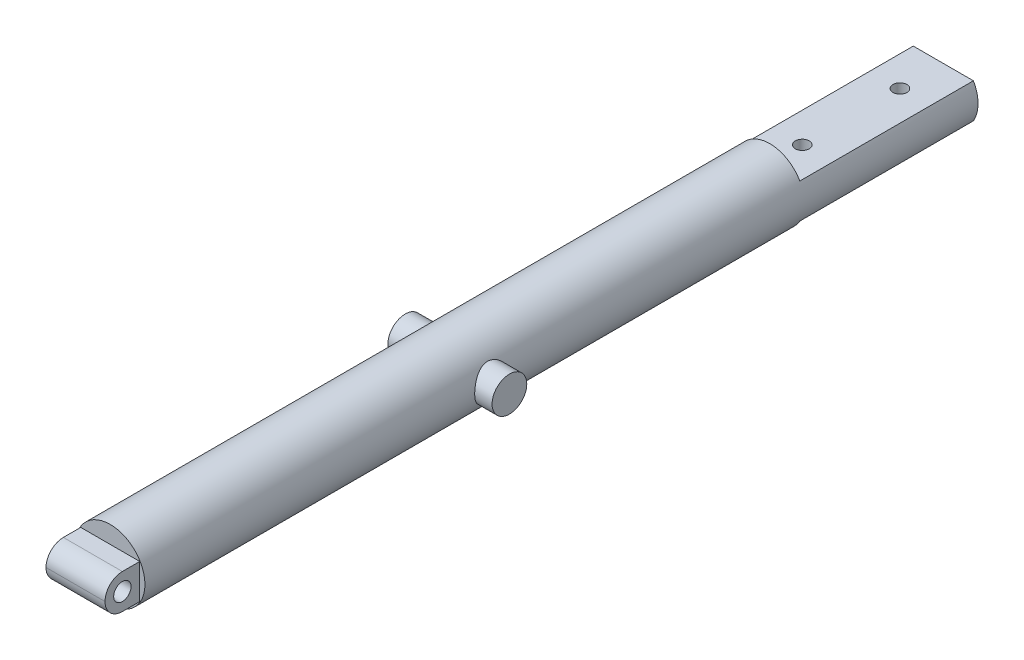
ISO-10303-21;
HEADER;
FILE_DESCRIPTION(('STEP AP214'),'2;1');
FILE_NAME('part.step','',(''),(''),'','','');
FILE_SCHEMA(('AUTOMOTIVE_DESIGN { 1 0 10303 214 1 1 1 1 }'));
ENDSEC;
DATA;
#1=APPLICATION_CONTEXT('core data for automotive mechanical design processes');
#2=APPLICATION_PROTOCOL_DEFINITION('international standard','automotive_design',2000,#1);
#3=PRODUCT_CONTEXT('',#1,'mechanical');
#4=PRODUCT('Part','Part','',(#3));
#5=PRODUCT_RELATED_PRODUCT_CATEGORY('part','',(#4));
#6=PRODUCT_DEFINITION_FORMATION('','',#4);
#7=PRODUCT_DEFINITION_CONTEXT('part definition',#1,'design');
#8=PRODUCT_DEFINITION('design','',#6,#7);
#9=PRODUCT_DEFINITION_SHAPE('','',#8);
#10=(LENGTH_UNIT() NAMED_UNIT(*) SI_UNIT(.MILLI.,.METRE.));
#11=(NAMED_UNIT(*) PLANE_ANGLE_UNIT() SI_UNIT($,.RADIAN.));
#12=(NAMED_UNIT(*) SI_UNIT($,.STERADIAN.) SOLID_ANGLE_UNIT());
#13=UNCERTAINTY_MEASURE_WITH_UNIT(LENGTH_MEASURE(1.E-05),#10,'distance_accuracy_value','');
#14=(GEOMETRIC_REPRESENTATION_CONTEXT(3) GLOBAL_UNCERTAINTY_ASSIGNED_CONTEXT((#13)) GLOBAL_UNIT_ASSIGNED_CONTEXT((#10,
#11,#12)) REPRESENTATION_CONTEXT('',''));
#15=CARTESIAN_POINT('',(0.,0.,0.));
#16=DIRECTION('',(0.,0.,1.));
#17=DIRECTION('',(1.,0.,0.));
#18=AXIS2_PLACEMENT_3D('',#15,#16,#17);
#19=CARTESIAN_POINT('',(0.,0.,152.4));
#20=DIRECTION('',(0.,0.,1.));
#21=DIRECTION('',(1.,0.,0.));
#22=AXIS2_PLACEMENT_3D('',#19,#20,#21);
#23=PLANE('',#22);
#24=CARTESIAN_POINT('',(0.,0.,152.4));
#25=DIRECTION('',(0.,0.,1.));
#26=DIRECTION('',(1.,0.,0.));
#27=AXIS2_PLACEMENT_3D('',#24,#25,#26);
#28=CIRCLE('',#27,12.7);
#29=CARTESIAN_POINT('',(12.7,0.,152.4));
#30=VERTEX_POINT('',#29);
#31=EDGE_CURVE('E186',#30,#30,#28,.T.);
#32=ORIENTED_EDGE('',*,*,#31,.T.);
#33=EDGE_LOOP('',(#32));
#34=FACE_BOUND('',#33,.T.);
#35=DIRECTION('',(0.,-1.,0.));
#36=VECTOR('',#35,1.);
#37=CARTESIAN_POINT('',(-10.795,6.35000000000002,152.4));
#38=LINE('',#37,#36);
#39=CARTESIAN_POINT('',(-10.795,6.35000000000002,152.4));
#40=VERTEX_POINT('',#39);
#41=CARTESIAN_POINT('',(-10.795,-6.35000000000001,152.4));
#42=VERTEX_POINT('',#41);
#43=EDGE_CURVE('E139',#40,#42,#38,.T.);
#44=ORIENTED_EDGE('',*,*,#43,.F.);
#45=DIRECTION('',(1.,0.,0.));
#46=VECTOR('',#45,1.);
#47=CARTESIAN_POINT('',(-10.795,6.35000000000002,152.4));
#48=LINE('',#47,#46);
#49=CARTESIAN_POINT('',(10.795,6.35000000000002,152.4));
#50=VERTEX_POINT('',#49);
#51=EDGE_CURVE('E281',#40,#50,#48,.T.);
#52=ORIENTED_EDGE('',*,*,#51,.T.);
#53=DIRECTION('',(0.,-1.,0.));
#54=VECTOR('',#53,1.);
#55=CARTESIAN_POINT('',(10.795,6.35000000000002,152.4));
#56=LINE('',#55,#54);
#57=CARTESIAN_POINT('',(10.795,-6.35000000000001,152.4));
#58=VERTEX_POINT('',#57);
#59=EDGE_CURVE('E142',#50,#58,#56,.T.);
#60=ORIENTED_EDGE('',*,*,#59,.T.);
#61=DIRECTION('',(1.,0.,0.));
#62=VECTOR('',#61,1.);
#63=CARTESIAN_POINT('',(-10.795,-6.35000000000001,152.4));
#64=LINE('',#63,#62);
#65=EDGE_CURVE('E128',#42,#58,#64,.T.);
#66=ORIENTED_EDGE('',*,*,#65,.F.);
#67=EDGE_LOOP('',(#44,#52,#60,#66));
#68=FACE_BOUND('',#67,.T.);
#69=ADVANCED_FACE('F56',(#34,#68),#23,.T.);
#70=CARTESIAN_POINT('',(0.,0.,152.4));
#71=DIRECTION('',(0.,0.,-1.));
#72=DIRECTION('',(-1.,0.,0.));
#73=AXIS2_PLACEMENT_3D('',#70,#71,#72);
#74=CYLINDRICAL_SURFACE('',#73,12.7);
#75=CARTESIAN_POINT('',(-12.7,0.,31.7500000000001));
#76=CARTESIAN_POINT('',(-12.6999994891774,0.166990879194913,31.7499994421759));
#77=CARTESIAN_POINT('',(-12.6966986728259,0.333993450198631,31.7434051711993));
#78=CARTESIAN_POINT('',(-12.6835786203218,0.666768526640046,31.7171033286682));
#79=CARTESIAN_POINT('',(-12.6737565484519,0.832540465223132,31.6973900524077));
#80=CARTESIAN_POINT('',(-12.6478292478082,1.16177467728404,31.6450462013111));
#81=CARTESIAN_POINT('',(-12.6317150589571,1.32523331106835,31.6123972048197));
#82=CARTESIAN_POINT('',(-12.5936085062318,1.6484934824779,31.5345436700231));
#83=CARTESIAN_POINT('',(-12.5716137398496,1.80829349634149,31.4893339997624));
#84=CARTESIAN_POINT('',(-12.5223959142721,2.12244180878879,31.3870611803295));
#85=CARTESIAN_POINT('',(-12.4951959650805,2.27681076158406,31.3300503379439));
#86=CARTESIAN_POINT('',(-12.436150269919,2.57993454237571,31.2046002780589));
#87=CARTESIAN_POINT('',(-12.4043027843762,2.728687241851,31.1361567799234));
#88=CARTESIAN_POINT('',(-12.302881193969,3.16512812193646,30.9145916735138));
#89=CARTESIAN_POINT('',(-12.2273713354024,3.44334503957525,30.7451216410393));
#90=CARTESIAN_POINT('',(-12.0622186773861,3.98471796121714,30.3560574939862));
#91=CARTESIAN_POINT('',(-11.9719972312188,4.24594454614361,30.1340512417935));
#92=CARTESIAN_POINT('',(-11.7893960148839,4.72936553155197,29.6511481911965));
#93=CARTESIAN_POINT('',(-11.6970146601478,4.95153018780441,29.3902220337444));
#94=CARTESIAN_POINT('',(-11.5603243398217,5.2595539877823,28.9628248667094));
#95=CARTESIAN_POINT('',(-11.5134721485475,5.3610627049131,28.8082038937615));
#96=CARTESIAN_POINT('',(-11.4233099497228,5.55058368760463,28.4899476154752));
#97=CARTESIAN_POINT('',(-11.3799984680683,5.63860158329208,28.3263161094703));
#98=CARTESIAN_POINT('',(-11.2984098057888,5.800358082891,27.9909478644053));
#99=CARTESIAN_POINT('',(-11.2601322945723,5.87409762464252,27.8192116586055));
#100=CARTESIAN_POINT('',(-11.1900882100936,6.0064578883652,27.4688169432002));
#101=CARTESIAN_POINT('',(-11.1583177917589,6.0650875441624,27.2901625962079));
#102=CARTESIAN_POINT('',(-11.104259497995,6.16347180761616,26.9380237910297));
#103=CARTESIAN_POINT('',(-11.08151961136,6.20414249112448,26.7648649825109));
#104=CARTESIAN_POINT('',(-11.0438804844397,6.27089941680447,26.4149100900956));
#105=CARTESIAN_POINT('',(-11.0289809087597,6.29698628284913,26.2381141621247));
#106=CARTESIAN_POINT('',(-11.0076763086803,6.33415533919377,25.8825907052358));
#107=CARTESIAN_POINT('',(-11.0012640993806,6.34525022098376,25.7038649394044));
#108=CARTESIAN_POINT('',(-10.9972004886715,6.35229110757549,25.3460234576936));
#109=CARTESIAN_POINT('',(-10.9995482514047,6.34823855771195,25.1669077806486));
#110=CARTESIAN_POINT('',(-11.012090292946,6.32645177136463,24.831417698125));
#111=CARTESIAN_POINT('',(-11.0213095833287,6.31041699475489,24.6748926401298));
#112=CARTESIAN_POINT('',(-11.046128374712,6.2668713449148,24.3639094653422));
#113=CARTESIAN_POINT('',(-11.0617299789813,6.23935668847137,24.2094520472785));
#114=CARTESIAN_POINT('',(-11.0988027904553,6.17316873448519,23.903688703298));
#115=CARTESIAN_POINT('',(-11.120273227066,6.13449690187387,23.7523823664406));
#116=CARTESIAN_POINT('',(-11.1684190383084,6.04639785576762,23.4537613579967));
#117=CARTESIAN_POINT('',(-11.1950964580098,5.99696641549928,23.3064482807581));
#118=CARTESIAN_POINT('',(-11.2831376118079,5.83067999912415,22.8650712730653));
#119=CARTESIAN_POINT('',(-11.351625656313,5.69733157989736,22.5784494378062));
#120=CARTESIAN_POINT('',(-11.500071400071,5.39139880582654,22.0304231498828));
#121=CARTESIAN_POINT('',(-11.5800342452273,5.21879682720651,21.7690300995701));
#122=CARTESIAN_POINT('',(-11.7546812882033,4.81373716307426,21.2438125690413));
#123=CARTESIAN_POINT('',(-11.8499465086129,4.57646495884525,20.9838823296492));
#124=CARTESIAN_POINT('',(-12.0362854764244,4.06112275052911,20.5057965991382));
#125=CARTESIAN_POINT('',(-12.1273572049436,3.78303336001456,20.2876610728589));
#126=CARTESIAN_POINT('',(-12.255938857257,3.33286643739698,19.9917786254829));
#127=CARTESIAN_POINT('',(-12.2983050254296,3.17335722609793,19.8966401532776));
#128=CARTESIAN_POINT('',(-12.3782218301755,2.8456977162644,19.7202932887564));
#129=CARTESIAN_POINT('',(-12.4157746297482,2.67755134695863,19.6390786338708));
#130=CARTESIAN_POINT('',(-12.4849579292559,2.33378760343931,19.4914534288931));
#131=CARTESIAN_POINT('',(-12.5165907293456,2.15817316355139,19.4250371271345));
#132=CARTESIAN_POINT('',(-12.5729876360055,1.80074808519267,19.3077783400176));
#133=CARTESIAN_POINT('',(-12.5977525327026,1.61893816219402,19.2569340630848));
#134=CARTESIAN_POINT('',(-12.6378915597613,1.26593635485429,19.1750530402546));
#135=CARTESIAN_POINT('',(-12.6538736459652,1.09511243698786,19.1427244136913));
#136=CARTESIAN_POINT('',(-12.6789562420375,0.750891318848444,19.0921544116369));
#137=CARTESIAN_POINT('',(-12.6880571262137,0.577494259066557,19.0739122699003));
#138=CARTESIAN_POINT('',(-12.6991158370576,0.229629611373428,19.0517612761007));
#139=CARTESIAN_POINT('',(-12.7010765197081,0.0551624794535747,19.0478466932072));
#140=CARTESIAN_POINT('',(-12.6978059034872,-0.293430507417557,19.0543886079495));
#141=CARTESIAN_POINT('',(-12.6925749229034,-0.467556377130821,19.0648444695801));
#142=CARTESIAN_POINT('',(-12.6757555094506,-0.800509536744057,19.0986136315206));
#143=CARTESIAN_POINT('',(-12.6646934781011,-0.959472887164135,19.1208630740019));
#144=CARTESIAN_POINT('',(-12.6368459564446,-1.27482840052129,19.1772211624817));
#145=CARTESIAN_POINT('',(-12.6200585231077,-1.43121967165999,19.2113338345825));
#146=CARTESIAN_POINT('',(-12.581159973299,-1.74030776864039,19.291047952959));
#147=CARTESIAN_POINT('',(-12.5590505630802,-1.89300576133386,19.3366457172723));
#148=CARTESIAN_POINT('',(-12.5099971792976,-2.19390570072535,19.4389143910585));
#149=CARTESIAN_POINT('',(-12.4830513245292,-2.34210587161404,19.4955896100324));
#150=CARTESIAN_POINT('',(-12.4240951779885,-2.63725856238891,19.621262293972));
#151=CARTESIAN_POINT('',(-12.3919635638501,-2.78405822350623,19.6905620050969));
#152=CARTESIAN_POINT('',(-12.32392525103,-3.07126756713197,19.8397813940777));
#153=CARTESIAN_POINT('',(-12.2880172735192,-3.21167506178123,19.9197046719357));
#154=CARTESIAN_POINT('',(-12.1757741292216,-3.62227376445689,20.1745491136815));
#155=CARTESIAN_POINT('',(-12.0948877082824,-3.8819954012841,20.3646110787881));
#156=CARTESIAN_POINT('',(-11.9194499483036,-4.39279994151147,20.8011398441674));
#157=CARTESIAN_POINT('',(-11.8243367236915,-4.64052990372702,21.0513128051332));
#158=CARTESIAN_POINT('',(-11.6839772811164,-4.97892395439651,21.4549100898515));
#159=CARTESIAN_POINT('',(-11.6375432562751,-5.08625380253177,21.5942761051402));
#160=CARTESIAN_POINT('',(-11.5466734049483,-5.2892990887901,21.8819337426791));
#161=CARTESIAN_POINT('',(-11.5022378780468,-5.38501278922796,22.030226695378));
#162=CARTESIAN_POINT('',(-11.4145838039713,-5.56849389071526,22.3424281006111));
#163=CARTESIAN_POINT('',(-11.3715304916549,-5.65564549590478,22.5067454440509));
#164=CARTESIAN_POINT('',(-11.290579644901,-5.81556909376682,22.8433705339));
#165=CARTESIAN_POINT('',(-11.2526796279935,-5.88834801781485,23.0156743789891));
#166=CARTESIAN_POINT('',(-11.1834979926119,-6.01870593214496,23.3670791641594));
#167=CARTESIAN_POINT('',(-11.1522110654534,-6.07629712370975,23.5461745150594));
#168=CARTESIAN_POINT('',(-11.0975495796607,-6.1755660505623,23.9098983380203));
#169=CARTESIAN_POINT('',(-11.0741737959829,-6.21724624980147,24.0945259485843));
#170=CARTESIAN_POINT('',(-11.038221566145,-6.28083303239845,24.4497382585254));
#171=CARTESIAN_POINT('',(-11.0248238589961,-6.30425367574493,24.619969699185));
#172=CARTESIAN_POINT('',(-11.0059068618669,-6.33722186745438,24.9622059736914));
#173=CARTESIAN_POINT('',(-11.0003870360907,-6.34677035930015,25.1342106861318));
#174=CARTESIAN_POINT('',(-10.9974561088362,-6.3518475564986,25.4784312834341));
#175=CARTESIAN_POINT('',(-11.0000420081603,-6.34738144738997,25.6506470666263));
#176=CARTESIAN_POINT('',(-11.0132073594892,-6.32451076696088,25.9938336660464));
#177=CARTESIAN_POINT('',(-11.023786484255,-6.30610676625141,26.1648045329513));
#178=CARTESIAN_POINT('',(-11.0511312712702,-6.25804920718463,26.487829689896));
#179=CARTESIAN_POINT('',(-11.0672085028909,-6.22963986719981,26.6401293180212));
#180=CARTESIAN_POINT('',(-11.1050268373618,-6.16196939123336,26.9416003606677));
#181=CARTESIAN_POINT('',(-11.1267698205995,-6.12270465222518,27.0907707188327));
#182=CARTESIAN_POINT('',(-11.1995485940621,-5.98919755549727,27.5322243315878));
#183=CARTESIAN_POINT('',(-11.2581531108883,-5.87921095671373,27.8186570190924));
#184=CARTESIAN_POINT('',(-11.3937155944897,-5.61221709335547,28.3885160055318));
#185=CARTESIAN_POINT('',(-11.4716421113511,-5.45254719309569,28.6704473974524));
#186=CARTESIAN_POINT('',(-11.635439817654,-5.09367320950778,29.2053730733708));
#187=CARTESIAN_POINT('',(-11.7213151279082,-4.89444855823948,29.4583521942335));
#188=CARTESIAN_POINT('',(-11.9038699110716,-4.43354035272872,29.9602382551383));
#189=CARTESIAN_POINT('',(-12.0005943076297,-4.1672089491442,30.2049154327347));
#190=CARTESIAN_POINT('',(-12.1383310810892,-3.73813634318358,30.5363060499742));
#191=CARTESIAN_POINT('',(-12.1830529217554,-3.5900456973254,30.640905091954));
#192=CARTESIAN_POINT('',(-12.2688872478125,-3.28473589884859,30.8374551775996));
#193=CARTESIAN_POINT('',(-12.3100013738234,-3.12752095014407,30.9294119812597));
#194=CARTESIAN_POINT('',(-12.3878055405892,-2.80361177397836,31.1005331085148));
#195=CARTESIAN_POINT('',(-12.4244591999769,-2.63685404738455,31.1795938199597));
#196=CARTESIAN_POINT('',(-12.4919115290982,-2.2961439976254,31.3232062854185));
#197=CARTESIAN_POINT('',(-12.5227130740716,-2.12219525894011,31.3877651672765));
#198=CARTESIAN_POINT('',(-12.5775008101552,-1.76872534139739,31.5015167403404));
#199=CARTESIAN_POINT('',(-12.6015018553988,-1.58921727277203,31.5507429460023));
#200=CARTESIAN_POINT('',(-12.642019952057,-1.22585054083133,31.6333352690337));
#201=CARTESIAN_POINT('',(-12.6585415748002,-1.04199460738346,31.6667110745812));
#202=CARTESIAN_POINT('',(-12.6806500718221,-0.715063028653882,31.7112325619244));
#203=CARTESIAN_POINT('',(-12.6878936037074,-0.572548812651044,31.725757901848));
#204=CARTESIAN_POINT('',(-12.6975688534566,-0.286692618188954,31.7451419937193));
#205=CARTESIAN_POINT('',(-12.7000004385074,-0.143350616991762,31.7500004788551));
#206=CARTESIAN_POINT('',(-12.7,0.,31.7500000000001));
#207=B_SPLINE_CURVE_WITH_KNOTS('',3,(#75,#76,#77,#78,#79,#80,#81,#82,#83,#84,#85,#86,#87,#88,
#89,#90,#91,#92,#93,#94,#95,#96,#97,#98,#99,#100,#101,#102,#103,#104,#105,#106,#107,#108,#109,
#110,#111,#112,#113,#114,#115,#116,#117,#118,#119,#120,#121,#122,#123,#124,#125,#126,#127,#128,
#129,#130,#131,#132,#133,#134,#135,#136,#137,#138,#139,#140,#141,#142,#143,#144,#145,#146,#147,
#148,#149,#150,#151,#152,#153,#154,#155,#156,#157,#158,#159,#160,#161,#162,#163,#164,#165,#166,
#167,#168,#169,#170,#171,#172,#173,#174,#175,#176,#177,#178,#179,#180,#181,#182,#183,#184,#185,
#186,#187,#188,#189,#190,#191,#192,#193,#194,#195,#196,#197,#198,#199,#200,#201,#202,#203,#204,
#205,#206),.UNSPECIFIED.,.T.,.F.,(4,2,2,2,2,2,2,2,2,2,2,2,2,2,2,2,2,2,2,2,2,2,2,2,2,2,2,2,2,2,2,
2,2,2,2,2,2,2,2,2,2,2,2,2,2,2,2,2,2,2,2,2,2,2,2,2,2,2,2,2,2,2,2,2,2,4),(0.,0.500831224205361,
1.00188037372803,1.5036456429069,2.0056162222071,2.50540779268628,3.0053869172507,
4.00425210956757,5.06354639773448,6.12364383897772,6.69546056113471,7.26703799333406,
7.83857787007116,8.40977904053159,8.94696617231635,9.48413032231426,10.020839449589,
10.5574973665628,11.0297819407841,11.5022222802449,11.9746006167425,12.447164856978,
13.4133450583963,14.3799599077215,15.4691385823987,16.558836254714,17.1296896955319,
17.7002857039293,18.2706595507726,18.8409677509571,19.3640345307036,19.8870728558157,
20.4099019497636,20.9327079051584,21.4148301207384,21.8971161172382,22.3792476958438,
22.8615672144633,23.3574791185916,23.8535595025871,24.8452132673351,25.9342484207189,
26.4795520760265,27.0249372042286,27.5969396508645,28.1686655660688,28.7399307681394,
29.3111074690517,29.8274552059119,30.3437678229116,30.8598894217494,31.3759898919437,
31.8427315926276,32.3096283963947,33.2427989036526,34.2386648311406,35.2350499582129,
36.3525027406484,36.9121724680045,37.4715863502977,38.0352942497766,38.5987244700203,
39.1609143479984,39.7227601571806,40.1526787482413,40.5826092051903),.UNSPECIFIED.);
#208=CARTESIAN_POINT('',(-12.7,0.,31.7500000000001));
#209=VERTEX_POINT('',#208);
#210=EDGE_CURVE('E200',#209,#209,#207,.T.);
#211=ORIENTED_EDGE('',*,*,#210,.F.);
#212=EDGE_LOOP('',(#211));
#213=FACE_BOUND('',#212,.T.);
#214=CARTESIAN_POINT('',(12.7,0.,31.75));
#215=CARTESIAN_POINT('',(12.6999994891774,-0.166990879194913,31.7499994421759));
#216=CARTESIAN_POINT('',(12.6966986728259,-0.33399345019863,31.7434051711993));
#217=CARTESIAN_POINT('',(12.6835786203218,-0.666768526640043,31.7171033286682));
#218=CARTESIAN_POINT('',(12.6737565484519,-0.832540465223127,31.6973900524077));
#219=CARTESIAN_POINT('',(12.6478292478082,-1.16177467728403,31.6450462013111));
#220=CARTESIAN_POINT('',(12.6317150589571,-1.32523331106835,31.6123972048198));
#221=CARTESIAN_POINT('',(12.5936085062318,-1.64849348247789,31.5345436700231));
#222=CARTESIAN_POINT('',(12.5716137398496,-1.80829349634147,31.4893339997623));
#223=CARTESIAN_POINT('',(12.5223959142721,-2.12244180878878,31.3870611803294));
#224=CARTESIAN_POINT('',(12.4951959650805,-2.27681076158406,31.3300503379439));
#225=CARTESIAN_POINT('',(12.4361502699189,-2.57993454237573,31.2046002780589));
#226=CARTESIAN_POINT('',(12.4043027843762,-2.72868724185101,31.1361567799234));
#227=CARTESIAN_POINT('',(12.302881193969,-3.16512812193647,30.9145916735138));
#228=CARTESIAN_POINT('',(12.2273713354024,-3.44334503957525,30.7451216410393));
#229=CARTESIAN_POINT('',(12.0622186773861,-3.98471796121716,30.3560574939862));
#230=CARTESIAN_POINT('',(11.9719972312188,-4.24594454614363,30.1340512417935));
#231=CARTESIAN_POINT('',(11.7893960148839,-4.72936553155196,29.6511481911965));
#232=CARTESIAN_POINT('',(11.6970146601478,-4.95153018780438,29.3902220337444));
#233=CARTESIAN_POINT('',(11.5603243398217,-5.25955398778229,28.9628248667094));
#234=CARTESIAN_POINT('',(11.5134721485475,-5.36106270491311,28.8082038937615));
#235=CARTESIAN_POINT('',(11.4233099497228,-5.55058368760465,28.4899476154752));
#236=CARTESIAN_POINT('',(11.3799984680683,-5.63860158329209,28.3263161094703));
#237=CARTESIAN_POINT('',(11.2984098057888,-5.80035808289101,27.9909478644053));
#238=CARTESIAN_POINT('',(11.2601322945723,-5.87409762464254,27.8192116586055));
#239=CARTESIAN_POINT('',(11.1900882100936,-6.0064578883652,27.4688169432002));
#240=CARTESIAN_POINT('',(11.1583177917589,-6.06508754416238,27.2901625962079));
#241=CARTESIAN_POINT('',(11.104259497995,-6.16347180761614,26.9380237910296));
#242=CARTESIAN_POINT('',(11.08151961136,-6.20414249112448,26.7648649825109));
#243=CARTESIAN_POINT('',(11.0438804844397,-6.27089941680449,26.4149100900956));
#244=CARTESIAN_POINT('',(11.0289809087597,-6.29698628284914,26.2381141621247));
#245=CARTESIAN_POINT('',(11.0076763086803,-6.33415533919378,25.8825907052358));
#246=CARTESIAN_POINT('',(11.0012640993806,-6.34525022098377,25.7038649394044));
#247=CARTESIAN_POINT('',(10.9972004886715,-6.3522911075755,25.3460234576936));
#248=CARTESIAN_POINT('',(10.9995482514047,-6.34823855771196,25.1669077806486));
#249=CARTESIAN_POINT('',(11.012090292946,-6.32645177136464,24.831417698125));
#250=CARTESIAN_POINT('',(11.0213095833287,-6.3104169947549,24.6748926401298));
#251=CARTESIAN_POINT('',(11.046128374712,-6.26687134491481,24.3639094653422));
#252=CARTESIAN_POINT('',(11.0617299789813,-6.23935668847138,24.2094520472785));
#253=CARTESIAN_POINT('',(11.0988027904553,-6.1731687344852,23.903688703298));
#254=CARTESIAN_POINT('',(11.120273227066,-6.13449690187388,23.7523823664406));
#255=CARTESIAN_POINT('',(11.1684190383084,-6.04639785576763,23.4537613579967));
#256=CARTESIAN_POINT('',(11.1950964580098,-5.99696641549927,23.3064482807582));
#257=CARTESIAN_POINT('',(11.2831376118079,-5.83067999912412,22.8650712730653));
#258=CARTESIAN_POINT('',(11.351625656313,-5.69733157989736,22.5784494378062));
#259=CARTESIAN_POINT('',(11.500071400071,-5.39139880582654,22.0304231498828));
#260=CARTESIAN_POINT('',(11.5800342452273,-5.21879682720649,21.7690300995701));
#261=CARTESIAN_POINT('',(11.7546812882032,-4.81373716307424,21.2438125690413));
#262=CARTESIAN_POINT('',(11.8499465086129,-4.57646495884523,20.9838823296492));
#263=CARTESIAN_POINT('',(12.0362854764244,-4.06112275052911,20.5057965991382));
#264=CARTESIAN_POINT('',(12.1273572049436,-3.78303336001456,20.2876610728589));
#265=CARTESIAN_POINT('',(12.255938857257,-3.33286643739698,19.9917786254828));
#266=CARTESIAN_POINT('',(12.2983050254296,-3.17335722609793,19.8966401532776));
#267=CARTESIAN_POINT('',(12.3782218301755,-2.8456977162644,19.7202932887564));
#268=CARTESIAN_POINT('',(12.4157746297482,-2.67755134695863,19.6390786338708));
#269=CARTESIAN_POINT('',(12.4849579292559,-2.33378760343932,19.4914534288931));
#270=CARTESIAN_POINT('',(12.5165907293456,-2.15817316355139,19.4250371271345));
#271=CARTESIAN_POINT('',(12.5729876360055,-1.80074808519268,19.3077783400176));
#272=CARTESIAN_POINT('',(12.5977525327026,-1.61893816219403,19.2569340630848));
#273=CARTESIAN_POINT('',(12.6378915597613,-1.26593635485429,19.1750530402546));
#274=CARTESIAN_POINT('',(12.6538736459652,-1.09511243698787,19.1427244136913));
#275=CARTESIAN_POINT('',(12.6789562420375,-0.75089131884844,19.0921544116369));
#276=CARTESIAN_POINT('',(12.6880571262137,-0.57749425906655,19.0739122699003));
#277=CARTESIAN_POINT('',(12.6991158370576,-0.229629611373416,19.0517612761007));
#278=CARTESIAN_POINT('',(12.7010765197081,-0.0551624794535614,19.0478466932072));
#279=CARTESIAN_POINT('',(12.6978059034872,0.293430507417575,19.0543886079495));
#280=CARTESIAN_POINT('',(12.6925749229034,0.467556377130842,19.0648444695801));
#281=CARTESIAN_POINT('',(12.6757555094506,0.80050953674408,19.0986136315206));
#282=CARTESIAN_POINT('',(12.6646934781011,0.959472887164156,19.1208630740019));
#283=CARTESIAN_POINT('',(12.6368459564446,1.27482840052131,19.1772211624817));
#284=CARTESIAN_POINT('',(12.6200585231077,1.43121967166,19.2113338345825));
#285=CARTESIAN_POINT('',(12.581159973299,1.7403077686404,19.291047952959));
#286=CARTESIAN_POINT('',(12.5590505630801,1.89300576133386,19.3366457172723));
#287=CARTESIAN_POINT('',(12.5099971792976,2.19390570072535,19.4389143910585));
#288=CARTESIAN_POINT('',(12.4830513245292,2.34210587161405,19.4955896100324));
#289=CARTESIAN_POINT('',(12.4240951779885,2.63725856238891,19.621262293972));
#290=CARTESIAN_POINT('',(12.3919635638501,2.78405822350622,19.6905620050969));
#291=CARTESIAN_POINT('',(12.32392525103,3.07126756713196,19.8397813940777));
#292=CARTESIAN_POINT('',(12.2880172735192,3.21167506178122,19.9197046719357));
#293=CARTESIAN_POINT('',(12.1757741292216,3.62227376445689,20.1745491136815));
#294=CARTESIAN_POINT('',(12.0948877082824,3.8819954012841,20.3646110787881));
#295=CARTESIAN_POINT('',(11.9194499483036,4.39279994151147,20.8011398441674));
#296=CARTESIAN_POINT('',(11.8243367236915,4.64052990372701,21.0513128051332));
#297=CARTESIAN_POINT('',(11.6839772811164,4.9789239543965,21.4549100898515));
#298=CARTESIAN_POINT('',(11.6375432562751,5.08625380253176,21.5942761051402));
#299=CARTESIAN_POINT('',(11.5466734049483,5.28929908879009,21.8819337426791));
#300=CARTESIAN_POINT('',(11.5022378780468,5.38501278922795,22.030226695378));
#301=CARTESIAN_POINT('',(11.4145838039713,5.56849389071526,22.3424281006111));
#302=CARTESIAN_POINT('',(11.3715304916549,5.65564549590478,22.5067454440509));
#303=CARTESIAN_POINT('',(11.290579644901,5.81556909376682,22.8433705339));
#304=CARTESIAN_POINT('',(11.2526796279935,5.88834801781485,23.0156743789891));
#305=CARTESIAN_POINT('',(11.1834979926119,6.01870593214496,23.3670791641594));
#306=CARTESIAN_POINT('',(11.1522110654534,6.07629712370974,23.5461745150594));
#307=CARTESIAN_POINT('',(11.0975495796607,6.1755660505623,23.9098983380203));
#308=CARTESIAN_POINT('',(11.0741737959829,6.21724624980147,24.0945259485843));
#309=CARTESIAN_POINT('',(11.038221566145,6.28083303239845,24.4497382585254));
#310=CARTESIAN_POINT('',(11.0248238589961,6.30425367574493,24.619969699185));
#311=CARTESIAN_POINT('',(11.0059068618669,6.33722186745437,24.9622059736914));
#312=CARTESIAN_POINT('',(11.0003870360907,6.34677035930014,25.1342106861318));
#313=CARTESIAN_POINT('',(10.9974561088362,6.35184755649859,25.4784312834341));
#314=CARTESIAN_POINT('',(11.0000420081603,6.34738144738996,25.6506470666263));
#315=CARTESIAN_POINT('',(11.0132073594892,6.32451076696088,25.9938336660463));
#316=CARTESIAN_POINT('',(11.023786484255,6.30610676625142,26.1648045329513));
#317=CARTESIAN_POINT('',(11.0511312712702,6.25804920718464,26.4878296898959));
#318=CARTESIAN_POINT('',(11.0672085028909,6.22963986719982,26.6401293180212));
#319=CARTESIAN_POINT('',(11.1050268373618,6.16196939123335,26.9416003606676));
#320=CARTESIAN_POINT('',(11.1267698205995,6.12270465222518,27.0907707188327));
#321=CARTESIAN_POINT('',(11.1995485940621,5.98919755549727,27.5322243315878));
#322=CARTESIAN_POINT('',(11.2581531108883,5.87921095671374,27.8186570190924));
#323=CARTESIAN_POINT('',(11.3937155944897,5.61221709335548,28.3885160055318));
#324=CARTESIAN_POINT('',(11.4716421113511,5.45254719309569,28.6704473974524));
#325=CARTESIAN_POINT('',(11.635439817654,5.09367320950778,29.2053730733708));
#326=CARTESIAN_POINT('',(11.7213151279082,4.89444855823949,29.4583521942335));
#327=CARTESIAN_POINT('',(11.9038699110716,4.43354035272873,29.9602382551383));
#328=CARTESIAN_POINT('',(12.0005943076297,4.1672089491442,30.2049154327347));
#329=CARTESIAN_POINT('',(12.1383310810892,3.73813634318358,30.5363060499742));
#330=CARTESIAN_POINT('',(12.1830529217554,3.5900456973254,30.640905091954));
#331=CARTESIAN_POINT('',(12.2688872478125,3.28473589884859,30.8374551775996));
#332=CARTESIAN_POINT('',(12.3100013738234,3.12752095014408,30.9294119812597));
#333=CARTESIAN_POINT('',(12.3878055405892,2.80361177397837,31.1005331085148));
#334=CARTESIAN_POINT('',(12.4244591999769,2.63685404738456,31.1795938199596));
#335=CARTESIAN_POINT('',(12.4919115290982,2.29614399762541,31.3232062854184));
#336=CARTESIAN_POINT('',(12.5227130740716,2.12219525894012,31.3877651672765));
#337=CARTESIAN_POINT('',(12.5775008101552,1.76872534139741,31.5015167403404));
#338=CARTESIAN_POINT('',(12.6015018553988,1.58921727277204,31.5507429460023));
#339=CARTESIAN_POINT('',(12.642019952057,1.22585054083135,31.6333352690337));
#340=CARTESIAN_POINT('',(12.6585415748002,1.04199460738347,31.6667110745812));
#341=CARTESIAN_POINT('',(12.6806500718221,0.715063028653895,31.7112325619244));
#342=CARTESIAN_POINT('',(12.6878936037074,0.572548812651053,31.725757901848));
#343=CARTESIAN_POINT('',(12.6975688534566,0.286692618188957,31.7451419937193));
#344=CARTESIAN_POINT('',(12.7000004385074,0.143350616991763,31.7500004788551));
#345=CARTESIAN_POINT('',(12.7,0.,31.75));
#346=B_SPLINE_CURVE_WITH_KNOTS('',3,(#214,#215,#216,#217,#218,#219,#220,#221,#222,#223,#224,
#225,#226,#227,#228,#229,#230,#231,#232,#233,#234,#235,#236,#237,#238,#239,#240,#241,#242,#243,
#244,#245,#246,#247,#248,#249,#250,#251,#252,#253,#254,#255,#256,#257,#258,#259,#260,#261,#262,
#263,#264,#265,#266,#267,#268,#269,#270,#271,#272,#273,#274,#275,#276,#277,#278,#279,#280,#281,
#282,#283,#284,#285,#286,#287,#288,#289,#290,#291,#292,#293,#294,#295,#296,#297,#298,#299,#300,
#301,#302,#303,#304,#305,#306,#307,#308,#309,#310,#311,#312,#313,#314,#315,#316,#317,#318,#319,
#320,#321,#322,#323,#324,#325,#326,#327,#328,#329,#330,#331,#332,#333,#334,#335,#336,#337,#338,
#339,#340,#341,#342,#343,#344,#345),.UNSPECIFIED.,.T.,.F.,(4,2,2,2,2,2,2,2,2,2,2,2,2,2,2,2,2,2,
2,2,2,2,2,2,2,2,2,2,2,2,2,2,2,2,2,2,2,2,2,2,2,2,2,2,2,2,2,2,2,2,2,2,2,2,2,2,2,2,2,2,2,2,2,2,2,
4),(0.,0.50083122420536,1.00188037372803,1.50364564290689,2.0056162222071,2.50540779268628,
3.00538691725071,4.00425210956757,5.06354639773448,6.12364383897773,6.69546056113472,
7.26703799333407,7.83857787007117,8.4097790405316,8.94696617231636,9.48413032231426,
10.020839449589,10.5574973665628,11.0297819407841,11.5022222802449,11.9746006167425,
12.447164856978,13.4133450583963,14.3799599077215,15.4691385823987,16.558836254714,
17.1296896955319,17.7002857039293,18.2706595507726,18.8409677509571,19.3640345307036,
19.8870728558157,20.4099019497636,20.9327079051584,21.4148301207384,21.8971161172382,
22.3792476958438,22.8615672144633,23.3574791185916,23.8535595025871,24.8452132673351,
25.9342484207189,26.4795520760265,27.0249372042286,27.5969396508645,28.1686655660688,
28.7399307681394,29.3111074690516,29.8274552059119,30.3437678229116,30.8598894217494,
31.3759898919437,31.8427315926275,32.3096283963947,33.2427989036526,34.2386648311406,
35.2350499582129,36.3525027406484,36.9121724680045,37.4715863502977,38.0352942497766,
38.5987244700203,39.1609143479984,39.7227601571806,40.1526787482413,40.5826092051903),.UNSPECIFIED.);
#347=CARTESIAN_POINT('',(12.7,0.,31.75));
#348=VERTEX_POINT('',#347);
#349=EDGE_CURVE('E189',#348,#348,#346,.T.);
#350=ORIENTED_EDGE('',*,*,#349,.F.);
#351=EDGE_LOOP('',(#350));
#352=FACE_BOUND('',#351,.T.);
#353=ORIENTED_EDGE('',*,*,#31,.F.);
#354=EDGE_LOOP('',(#353));
#355=FACE_BOUND('',#354,.T.);
#356=DIRECTION('',(0.,0.,-1.));
#357=VECTOR('',#356,1.);
#358=CARTESIAN_POINT('',(10.9985226280624,6.35000000000002,152.4));
#359=LINE('',#358,#357);
#360=CARTESIAN_POINT('',(10.9985226280624,6.35000000000002,-88.9));
#361=VERTEX_POINT('',#360);
#362=CARTESIAN_POINT('',(10.9985226280624,6.35000000000002,-152.400000000001));
#363=VERTEX_POINT('',#362);
#364=EDGE_CURVE('E169',#361,#363,#359,.T.);
#365=ORIENTED_EDGE('',*,*,#364,.F.);
#366=CARTESIAN_POINT('',(0.,0.,-88.8999999999999));
#367=DIRECTION('',(0.,0.,-1.));
#368=DIRECTION('',(-1.,0.,0.));
#369=AXIS2_PLACEMENT_3D('',#366,#367,#368);
#370=CIRCLE('',#369,12.7);
#371=CARTESIAN_POINT('',(-10.9985226280624,6.35000000000002,-88.9));
#372=VERTEX_POINT('',#371);
#373=EDGE_CURVE('E240',#372,#361,#370,.T.);
#374=ORIENTED_EDGE('',*,*,#373,.F.);
#375=DIRECTION('',(0.,0.,-1.));
#376=VECTOR('',#375,1.);
#377=CARTESIAN_POINT('',(-10.9985226280624,6.35000000000002,152.4));
#378=LINE('',#377,#376);
#379=CARTESIAN_POINT('',(-10.9985226280624,6.35000000000002,-152.4));
#380=VERTEX_POINT('',#379);
#381=EDGE_CURVE('E167',#380,#372,#378,.F.);
#382=ORIENTED_EDGE('',*,*,#381,.F.);
#383=CARTESIAN_POINT('',(0.,0.,-152.400000000001));
#384=DIRECTION('',(0.,0.,1.));
#385=DIRECTION('',(1.,0.,0.));
#386=AXIS2_PLACEMENT_3D('',#383,#384,#385);
#387=CIRCLE('',#386,12.7);
#388=CARTESIAN_POINT('',(-10.9985226280624,-6.35000000000002,-152.4));
#389=VERTEX_POINT('',#388);
#390=EDGE_CURVE('E183',#380,#389,#387,.T.);
#391=ORIENTED_EDGE('',*,*,#390,.T.);
#392=DIRECTION('',(0.,0.,-1.));
#393=VECTOR('',#392,1.);
#394=CARTESIAN_POINT('',(-10.9985226280624,-6.35000000000001,152.4));
#395=LINE('',#394,#393);
#396=CARTESIAN_POINT('',(-10.9985226280624,-6.35000000000002,-88.8999999999999));
#397=VERTEX_POINT('',#396);
#398=EDGE_CURVE('E176',#397,#389,#395,.T.);
#399=ORIENTED_EDGE('',*,*,#398,.F.);
#400=CARTESIAN_POINT('',(0.,0.,-88.8999999999999));
#401=DIRECTION('',(0.,0.,1.));
#402=DIRECTION('',(1.,0.,0.));
#403=AXIS2_PLACEMENT_3D('',#400,#401,#402);
#404=CIRCLE('',#403,12.7);
#405=CARTESIAN_POINT('',(10.9985226280624,-6.35000000000002,-88.8999999999999));
#406=VERTEX_POINT('',#405);
#407=EDGE_CURVE('E241',#397,#406,#404,.T.);
#408=ORIENTED_EDGE('',*,*,#407,.T.);
#409=DIRECTION('',(0.,0.,-1.));
#410=VECTOR('',#409,1.);
#411=CARTESIAN_POINT('',(10.9985226280624,-6.35000000000001,152.4));
#412=LINE('',#411,#410);
#413=CARTESIAN_POINT('',(10.9985226280624,-6.35000000000002,-152.4));
#414=VERTEX_POINT('',#413);
#415=EDGE_CURVE('E174',#414,#406,#412,.F.);
#416=ORIENTED_EDGE('',*,*,#415,.F.);
#417=EDGE_CURVE('E190',#414,#363,#387,.T.);
#418=ORIENTED_EDGE('',*,*,#417,.T.);
#419=EDGE_LOOP('',(#365,#374,#382,#391,#399,#408,#416,#418));
#420=FACE_BOUND('',#419,.T.);
#421=ADVANCED_FACE('F205',(#213,#352,#355,#420),#74,.T.);
#422=CARTESIAN_POINT('',(0.,0.,-152.400000000001));
#423=DIRECTION('',(0.,0.,1.));
#424=DIRECTION('',(1.,0.,0.));
#425=AXIS2_PLACEMENT_3D('',#422,#423,#424);
#426=PLANE('',#425);
#427=DIRECTION('',(-1.,0.,0.));
#428=VECTOR('',#427,1.);
#429=CARTESIAN_POINT('',(0.,6.35000000000002,-152.400000000001));
#430=LINE('',#429,#428);
#431=EDGE_CURVE('E236',#363,#380,#430,.T.);
#432=ORIENTED_EDGE('',*,*,#431,.F.);
#433=ORIENTED_EDGE('',*,*,#417,.F.);
#434=DIRECTION('',(1.,0.,0.));
#435=VECTOR('',#434,1.);
#436=CARTESIAN_POINT('',(0.,-6.35000000000002,-152.4));
#437=LINE('',#436,#435);
#438=EDGE_CURVE('E252',#389,#414,#437,.T.);
#439=ORIENTED_EDGE('',*,*,#438,.F.);
#440=ORIENTED_EDGE('',*,*,#390,.F.);
#441=EDGE_LOOP('',(#432,#433,#439,#440));
#442=FACE_BOUND('',#441,.T.);
#443=ADVANCED_FACE('F220',(#442),#426,.F.);
#444=CARTESIAN_POINT('',(19.05,0.,25.4));
#445=DIRECTION('',(1.,0.,0.));
#446=DIRECTION('',(0.,0.,-1.));
#447=AXIS2_PLACEMENT_3D('',#444,#445,#446);
#448=PLANE('',#447);
#449=CARTESIAN_POINT('',(19.05,0.,25.4));
#450=DIRECTION('',(1.,0.,0.));
#451=DIRECTION('',(0.,0.,-1.));
#452=AXIS2_PLACEMENT_3D('',#449,#450,#451);
#453=CIRCLE('',#452,6.35);
#454=CARTESIAN_POINT('',(19.05,0.,19.05));
#455=VERTEX_POINT('',#454);
#456=EDGE_CURVE('E180',#455,#455,#453,.T.);
#457=ORIENTED_EDGE('',*,*,#456,.T.);
#458=EDGE_LOOP('',(#457));
#459=FACE_BOUND('',#458,.T.);
#460=ADVANCED_FACE('F222',(#459),#448,.T.);
#461=CARTESIAN_POINT('',(19.05,0.,25.4));
#462=DIRECTION('',(-1.,0.,0.));
#463=DIRECTION('',(0.,0.,1.));
#464=AXIS2_PLACEMENT_3D('',#461,#462,#463);
#465=CYLINDRICAL_SURFACE('',#464,6.35);
#466=ORIENTED_EDGE('',*,*,#456,.F.);
#467=EDGE_LOOP('',(#466));
#468=FACE_BOUND('',#467,.T.);
#469=ORIENTED_EDGE('',*,*,#349,.T.);
#470=EDGE_LOOP('',(#469));
#471=FACE_BOUND('',#470,.T.);
#472=ADVANCED_FACE('F214',(#468,#471),#465,.T.);
#473=CARTESIAN_POINT('',(-19.05,0.,25.4));
#474=DIRECTION('',(1.,0.,0.));
#475=DIRECTION('',(0.,0.,-1.));
#476=AXIS2_PLACEMENT_3D('',#473,#474,#475);
#477=CIRCLE('',#476,6.35);
#478=CARTESIAN_POINT('',(-19.05,0.,19.05));
#479=VERTEX_POINT('',#478);
#480=EDGE_CURVE('E179',#479,#479,#477,.T.);
#481=ORIENTED_EDGE('',*,*,#480,.T.);
#482=EDGE_LOOP('',(#481));
#483=FACE_BOUND('',#482,.T.);
#484=ORIENTED_EDGE('',*,*,#210,.T.);
#485=EDGE_LOOP('',(#484));
#486=FACE_BOUND('',#485,.T.);
#487=ADVANCED_FACE('F208',(#483,#486),#465,.T.);
#488=CARTESIAN_POINT('',(-19.05,0.,25.4));
#489=DIRECTION('',(1.,0.,0.));
#490=DIRECTION('',(0.,0.,-1.));
#491=AXIS2_PLACEMENT_3D('',#488,#489,#490);
#492=PLANE('',#491);
#493=ORIENTED_EDGE('',*,*,#480,.F.);
#494=EDGE_LOOP('',(#493));
#495=FACE_BOUND('',#494,.T.);
#496=ADVANCED_FACE('F213',(#495),#492,.F.);
#497=CARTESIAN_POINT('',(-12.7,-12.7,-88.9));
#498=DIRECTION('',(0.,0.,1.));
#499=DIRECTION('',(1.,0.,0.));
#500=AXIS2_PLACEMENT_3D('',#497,#498,#499);
#501=PLANE('',#500);
#502=DIRECTION('',(1.,0.,0.));
#503=VECTOR('',#502,1.);
#504=CARTESIAN_POINT('',(-12.7,-6.35000000000002,-88.8999999999999));
#505=LINE('',#504,#503);
#506=EDGE_CURVE('E171',#397,#406,#505,.T.);
#507=ORIENTED_EDGE('',*,*,#506,.T.);
#508=ORIENTED_EDGE('',*,*,#407,.F.);
#509=EDGE_LOOP('',(#507,#508));
#510=FACE_BOUND('',#509,.T.);
#511=ADVANCED_FACE('F254',(#510),#501,.F.);
#512=CARTESIAN_POINT('',(0.,-6.35,0.));
#513=DIRECTION('',(0.,-1.,0.));
#514=DIRECTION('',(0.,0.,-1.));
#515=AXIS2_PLACEMENT_3D('',#512,#513,#514);
#516=PLANE('',#515);
#517=CARTESIAN_POINT('',(0.,-6.35000000000002,-100.80625));
#518=DIRECTION('',(0.,-1.,0.));
#519=DIRECTION('',(0.,0.,-1.));
#520=AXIS2_PLACEMENT_3D('',#517,#518,#519);
#521=CIRCLE('',#520,2.54);
#522=CARTESIAN_POINT('',(0.,-6.35000000000002,-103.34625));
#523=VERTEX_POINT('',#522);
#524=EDGE_CURVE('E161',#523,#523,#521,.T.);
#525=ORIENTED_EDGE('',*,*,#524,.F.);
#526=EDGE_LOOP('',(#525));
#527=FACE_BOUND('',#526,.T.);
#528=CARTESIAN_POINT('',(0.,-6.35000000000002,-136.525));
#529=DIRECTION('',(0.,-1.,0.));
#530=DIRECTION('',(0.,0.,-1.));
#531=AXIS2_PLACEMENT_3D('',#528,#529,#530);
#532=CIRCLE('',#531,2.54);
#533=CARTESIAN_POINT('',(0.,-6.35000000000002,-139.065));
#534=VERTEX_POINT('',#533);
#535=EDGE_CURVE('E156',#534,#534,#532,.T.);
#536=ORIENTED_EDGE('',*,*,#535,.F.);
#537=EDGE_LOOP('',(#536));
#538=FACE_BOUND('',#537,.T.);
#539=ORIENTED_EDGE('',*,*,#398,.T.);
#540=ORIENTED_EDGE('',*,*,#438,.T.);
#541=ORIENTED_EDGE('',*,*,#415,.T.);
#542=ORIENTED_EDGE('',*,*,#506,.F.);
#543=EDGE_LOOP('',(#539,#540,#541,#542));
#544=FACE_BOUND('',#543,.T.);
#545=ADVANCED_FACE('F251',(#527,#538,#544),#516,.T.);
#546=CARTESIAN_POINT('',(-12.7,12.7,-88.8999999999999));
#547=DIRECTION('',(0.,0.,-1.));
#548=DIRECTION('',(-1.,0.,0.));
#549=AXIS2_PLACEMENT_3D('',#546,#547,#548);
#550=PLANE('',#549);
#551=ORIENTED_EDGE('',*,*,#373,.T.);
#552=DIRECTION('',(1.,0.,0.));
#553=VECTOR('',#552,1.);
#554=CARTESIAN_POINT('',(-12.7,6.35000000000002,-88.9));
#555=LINE('',#554,#553);
#556=EDGE_CURVE('E164',#372,#361,#555,.T.);
#557=ORIENTED_EDGE('',*,*,#556,.F.);
#558=EDGE_LOOP('',(#551,#557));
#559=FACE_BOUND('',#558,.T.);
#560=ADVANCED_FACE('F310',(#559),#550,.T.);
#561=CARTESIAN_POINT('',(0.,6.35000000000001,0.));
#562=DIRECTION('',(0.,1.,0.));
#563=DIRECTION('',(0.,0.,1.));
#564=AXIS2_PLACEMENT_3D('',#561,#562,#563);
#565=PLANE('',#564);
#566=CARTESIAN_POINT('',(0.,6.35000000000002,-100.80625));
#567=DIRECTION('',(0.,1.,0.));
#568=DIRECTION('',(0.,0.,1.));
#569=AXIS2_PLACEMENT_3D('',#566,#567,#568);
#570=CIRCLE('',#569,2.54);
#571=CARTESIAN_POINT('',(0.,6.35000000000002,-98.26625));
#572=VERTEX_POINT('',#571);
#573=EDGE_CURVE('E153',#572,#572,#570,.T.);
#574=ORIENTED_EDGE('',*,*,#573,.F.);
#575=EDGE_LOOP('',(#574));
#576=FACE_BOUND('',#575,.T.);
#577=CARTESIAN_POINT('',(0.,6.35000000000002,-136.525));
#578=DIRECTION('',(0.,1.,0.));
#579=DIRECTION('',(0.,0.,1.));
#580=AXIS2_PLACEMENT_3D('',#577,#578,#579);
#581=CIRCLE('',#580,2.54);
#582=CARTESIAN_POINT('',(0.,6.35000000000002,-133.985));
#583=VERTEX_POINT('',#582);
#584=EDGE_CURVE('E150',#583,#583,#581,.T.);
#585=ORIENTED_EDGE('',*,*,#584,.F.);
#586=EDGE_LOOP('',(#585));
#587=FACE_BOUND('',#586,.T.);
#588=ORIENTED_EDGE('',*,*,#364,.T.);
#589=ORIENTED_EDGE('',*,*,#431,.T.);
#590=ORIENTED_EDGE('',*,*,#381,.T.);
#591=ORIENTED_EDGE('',*,*,#556,.T.);
#592=EDGE_LOOP('',(#588,#589,#590,#591));
#593=FACE_BOUND('',#592,.T.);
#594=ADVANCED_FACE('F306',(#576,#587,#593),#565,.T.);
#595=CARTESIAN_POINT('',(0.,-12.7,-136.525));
#596=DIRECTION('',(0.,1.,0.));
#597=DIRECTION('',(0.,0.,1.));
#598=AXIS2_PLACEMENT_3D('',#595,#596,#597);
#599=CYLINDRICAL_SURFACE('',#598,2.54);
#600=ORIENTED_EDGE('',*,*,#535,.T.);
#601=EDGE_LOOP('',(#600));
#602=FACE_BOUND('',#601,.T.);
#603=ORIENTED_EDGE('',*,*,#584,.T.);
#604=EDGE_LOOP('',(#603));
#605=FACE_BOUND('',#604,.T.);
#606=ADVANCED_FACE('F298',(#602,#605),#599,.F.);
#607=CARTESIAN_POINT('',(0.,-12.7,-100.80625));
#608=DIRECTION('',(0.,1.,0.));
#609=DIRECTION('',(0.,0.,1.));
#610=AXIS2_PLACEMENT_3D('',#607,#608,#609);
#611=CYLINDRICAL_SURFACE('',#610,2.54);
#612=ORIENTED_EDGE('',*,*,#524,.T.);
#613=EDGE_LOOP('',(#612));
#614=FACE_BOUND('',#613,.T.);
#615=ORIENTED_EDGE('',*,*,#573,.T.);
#616=EDGE_LOOP('',(#615));
#617=FACE_BOUND('',#616,.T.);
#618=ADVANCED_FACE('F288',(#614,#617),#611,.F.);
#619=CARTESIAN_POINT('',(-10.795,6.35000000000001,165.1));
#620=DIRECTION('',(0.,1.,0.));
#621=DIRECTION('',(0.,0.,1.));
#622=AXIS2_PLACEMENT_3D('',#619,#620,#621);
#623=PLANE('',#622);
#624=DIRECTION('',(0.,0.,-1.));
#625=VECTOR('',#624,1.);
#626=CARTESIAN_POINT('',(-10.795,6.35000000000001,165.1));
#627=LINE('',#626,#625);
#628=CARTESIAN_POINT('',(-10.795,6.35000000000002,158.75));
#629=VERTEX_POINT('',#628);
#630=EDGE_CURVE('E132',#629,#40,#627,.T.);
#631=ORIENTED_EDGE('',*,*,#630,.F.);
#632=DIRECTION('',(1.,0.,0.));
#633=VECTOR('',#632,1.);
#634=CARTESIAN_POINT('',(10.795,6.35000000000002,158.75));
#635=LINE('',#634,#633);
#636=CARTESIAN_POINT('',(10.795,6.35000000000002,158.75));
#637=VERTEX_POINT('',#636);
#638=EDGE_CURVE('E13',#629,#637,#635,.T.);
#639=ORIENTED_EDGE('',*,*,#638,.T.);
#640=DIRECTION('',(0.,0.,-1.));
#641=VECTOR('',#640,1.);
#642=CARTESIAN_POINT('',(10.795,6.35000000000001,165.1));
#643=LINE('',#642,#641);
#644=EDGE_CURVE('E145',#637,#50,#643,.T.);
#645=ORIENTED_EDGE('',*,*,#644,.T.);
#646=ORIENTED_EDGE('',*,*,#51,.F.);
#647=EDGE_LOOP('',(#631,#639,#645,#646));
#648=FACE_BOUND('',#647,.T.);
#649=ADVANCED_FACE('F286',(#648),#623,.T.);
#650=CARTESIAN_POINT('',(-10.795,6.35000000000001,165.1));
#651=DIRECTION('',(1.,0.,0.));
#652=DIRECTION('',(0.,1.,0.));
#653=AXIS2_PLACEMENT_3D('',#650,#651,#652);
#654=PLANE('',#653);
#655=CARTESIAN_POINT('',(-10.795,0.,158.75));
#656=DIRECTION('',(-1.,0.,0.));
#657=DIRECTION('',(0.,-1.,0.));
#658=AXIS2_PLACEMENT_3D('',#655,#656,#657);
#659=CIRCLE('',#658,3.175);
#660=CARTESIAN_POINT('',(-10.795,-3.175,158.75));
#661=VERTEX_POINT('',#660);
#662=EDGE_CURVE('E276',#661,#661,#659,.T.);
#663=ORIENTED_EDGE('',*,*,#662,.F.);
#664=EDGE_LOOP('',(#663));
#665=FACE_BOUND('',#664,.T.);
#666=DIRECTION('',(0.,0.,-1.));
#667=VECTOR('',#666,1.);
#668=CARTESIAN_POINT('',(-10.795,-6.35,165.1));
#669=LINE('',#668,#667);
#670=CARTESIAN_POINT('',(-10.795,-6.35,158.75));
#671=VERTEX_POINT('',#670);
#672=EDGE_CURVE('E124',#671,#42,#669,.T.);
#673=ORIENTED_EDGE('',*,*,#672,.F.);
#674=CARTESIAN_POINT('',(-10.795,0.,158.75));
#675=DIRECTION('',(1.,0.,0.));
#676=DIRECTION('',(0.,1.,0.));
#677=AXIS2_PLACEMENT_3D('',#674,#675,#676);
#678=CIRCLE('',#677,6.35);
#679=CARTESIAN_POINT('',(-10.795,0.,165.1));
#680=VERTEX_POINT('',#679);
#681=EDGE_CURVE('E65',#671,#680,#678,.F.);
#682=ORIENTED_EDGE('',*,*,#681,.T.);
#683=CARTESIAN_POINT('',(-10.795,0.,158.75));
#684=DIRECTION('',(1.,0.,0.));
#685=DIRECTION('',(0.,1.,0.));
#686=AXIS2_PLACEMENT_3D('',#683,#684,#685);
#687=CIRCLE('',#686,6.35);
#688=EDGE_CURVE('E72',#680,#629,#687,.F.);
#689=ORIENTED_EDGE('',*,*,#688,.T.);
#690=ORIENTED_EDGE('',*,*,#630,.T.);
#691=ORIENTED_EDGE('',*,*,#43,.T.);
#692=EDGE_LOOP('',(#673,#682,#689,#690,#691));
#693=FACE_BOUND('',#692,.T.);
#694=ADVANCED_FACE('F144',(#665,#693),#654,.F.);
#695=CARTESIAN_POINT('',(-10.795,-6.35,165.1));
#696=DIRECTION('',(0.,1.,0.));
#697=DIRECTION('',(0.,0.,1.));
#698=AXIS2_PLACEMENT_3D('',#695,#696,#697);
#699=PLANE('',#698);
#700=DIRECTION('',(0.,0.,-1.));
#701=VECTOR('',#700,1.);
#702=CARTESIAN_POINT('',(10.795,-6.35,165.1));
#703=LINE('',#702,#701);
#704=CARTESIAN_POINT('',(10.795,-6.35,158.75));
#705=VERTEX_POINT('',#704);
#706=EDGE_CURVE('E133',#705,#58,#703,.T.);
#707=ORIENTED_EDGE('',*,*,#706,.F.);
#708=DIRECTION('',(1.,0.,0.));
#709=VECTOR('',#708,1.);
#710=CARTESIAN_POINT('',(-10.795,-6.35,158.75));
#711=LINE('',#710,#709);
#712=EDGE_CURVE('E130',#705,#671,#711,.F.);
#713=ORIENTED_EDGE('',*,*,#712,.T.);
#714=ORIENTED_EDGE('',*,*,#672,.T.);
#715=ORIENTED_EDGE('',*,*,#65,.T.);
#716=EDGE_LOOP('',(#707,#713,#714,#715));
#717=FACE_BOUND('',#716,.T.);
#718=ADVANCED_FACE('F127',(#717),#699,.F.);
#719=CARTESIAN_POINT('',(10.795,6.35000000000001,165.1));
#720=DIRECTION('',(1.,0.,0.));
#721=DIRECTION('',(0.,1.,0.));
#722=AXIS2_PLACEMENT_3D('',#719,#720,#721);
#723=PLANE('',#722);
#724=CARTESIAN_POINT('',(10.795,0.,158.75));
#725=DIRECTION('',(1.,0.,0.));
#726=DIRECTION('',(0.,1.,0.));
#727=AXIS2_PLACEMENT_3D('',#724,#725,#726);
#728=CIRCLE('',#727,3.175);
#729=CARTESIAN_POINT('',(10.795,3.17500000000001,158.75));
#730=VERTEX_POINT('',#729);
#731=EDGE_CURVE('E274',#730,#730,#728,.F.);
#732=ORIENTED_EDGE('',*,*,#731,.T.);
#733=EDGE_LOOP('',(#732));
#734=FACE_BOUND('',#733,.T.);
#735=CARTESIAN_POINT('',(10.795,0.,158.75));
#736=DIRECTION('',(1.,0.,0.));
#737=DIRECTION('',(0.,1.,0.));
#738=AXIS2_PLACEMENT_3D('',#735,#736,#737);
#739=CIRCLE('',#738,6.35);
#740=CARTESIAN_POINT('',(10.795,0.,165.1));
#741=VERTEX_POINT('',#740);
#742=EDGE_CURVE('E258',#637,#741,#739,.T.);
#743=ORIENTED_EDGE('',*,*,#742,.T.);
#744=CARTESIAN_POINT('',(10.795,0.,158.75));
#745=DIRECTION('',(1.,0.,0.));
#746=DIRECTION('',(0.,1.,0.));
#747=AXIS2_PLACEMENT_3D('',#744,#745,#746);
#748=CIRCLE('',#747,6.35);
#749=EDGE_CURVE('E260',#741,#705,#748,.T.);
#750=ORIENTED_EDGE('',*,*,#749,.T.);
#751=ORIENTED_EDGE('',*,*,#706,.T.);
#752=ORIENTED_EDGE('',*,*,#59,.F.);
#753=ORIENTED_EDGE('',*,*,#644,.F.);
#754=EDGE_LOOP('',(#743,#750,#751,#752,#753));
#755=FACE_BOUND('',#754,.T.);
#756=ADVANCED_FACE('F266',(#734,#755),#723,.T.);
#757=CARTESIAN_POINT('',(21.21,0.,158.75));
#758=DIRECTION('',(-1.,0.,0.));
#759=DIRECTION('',(0.,-1.,0.));
#760=AXIS2_PLACEMENT_3D('',#757,#758,#759);
#761=CYLINDRICAL_SURFACE('',#760,3.175);
#762=ORIENTED_EDGE('',*,*,#731,.F.);
#763=EDGE_LOOP('',(#762));
#764=FACE_BOUND('',#763,.T.);
#765=ORIENTED_EDGE('',*,*,#662,.T.);
#766=EDGE_LOOP('',(#765));
#767=FACE_BOUND('',#766,.T.);
#768=ADVANCED_FACE('F392',(#764,#767),#761,.F.);
#769=CARTESIAN_POINT('',(-10.795,0.,158.75));
#770=DIRECTION('',(-1.,0.,0.));
#771=DIRECTION('',(0.,0.,1.));
#772=AXIS2_PLACEMENT_3D('',#769,#770,#771);
#773=CYLINDRICAL_SURFACE('',#772,6.35);
#774=ORIENTED_EDGE('',*,*,#638,.F.);
#775=ORIENTED_EDGE('',*,*,#688,.F.);
#776=DIRECTION('',(1.,0.,0.));
#777=VECTOR('',#776,1.);
#778=CARTESIAN_POINT('',(-10.795,0.,165.1));
#779=LINE('',#778,#777);
#780=EDGE_CURVE('E60',#741,#680,#779,.F.);
#781=ORIENTED_EDGE('',*,*,#780,.F.);
#782=ORIENTED_EDGE('',*,*,#742,.F.);
#783=EDGE_LOOP('',(#774,#775,#781,#782));
#784=FACE_BOUND('',#783,.T.);
#785=ADVANCED_FACE('F58',(#784),#773,.T.);
#786=CARTESIAN_POINT('',(0.,0.,158.75));
#787=DIRECTION('',(1.,0.,0.));
#788=DIRECTION('',(0.,0.,-1.));
#789=AXIS2_PLACEMENT_3D('',#786,#787,#788);
#790=CYLINDRICAL_SURFACE('',#789,6.35);
#791=ORIENTED_EDGE('',*,*,#681,.F.);
#792=ORIENTED_EDGE('',*,*,#712,.F.);
#793=ORIENTED_EDGE('',*,*,#749,.F.);
#794=ORIENTED_EDGE('',*,*,#780,.T.);
#795=EDGE_LOOP('',(#791,#792,#793,#794));
#796=FACE_BOUND('',#795,.T.);
#797=ADVANCED_FACE('F272',(#796),#790,.T.);
#798=CLOSED_SHELL('',(#69,#421,#443,#460,#472,#487,#496,#511,#545,#560,#594,#606,#618,#649,#694,
#718,#756,#768,#785,#797));
#799=MANIFOLD_SOLID_BREP('B2',#798);
#800=ADVANCED_BREP_SHAPE_REPRESENTATION('',(#18,#799),#14);
#801=SHAPE_DEFINITION_REPRESENTATION(#9,#800);
ENDSEC;
END-ISO-10303-21;
